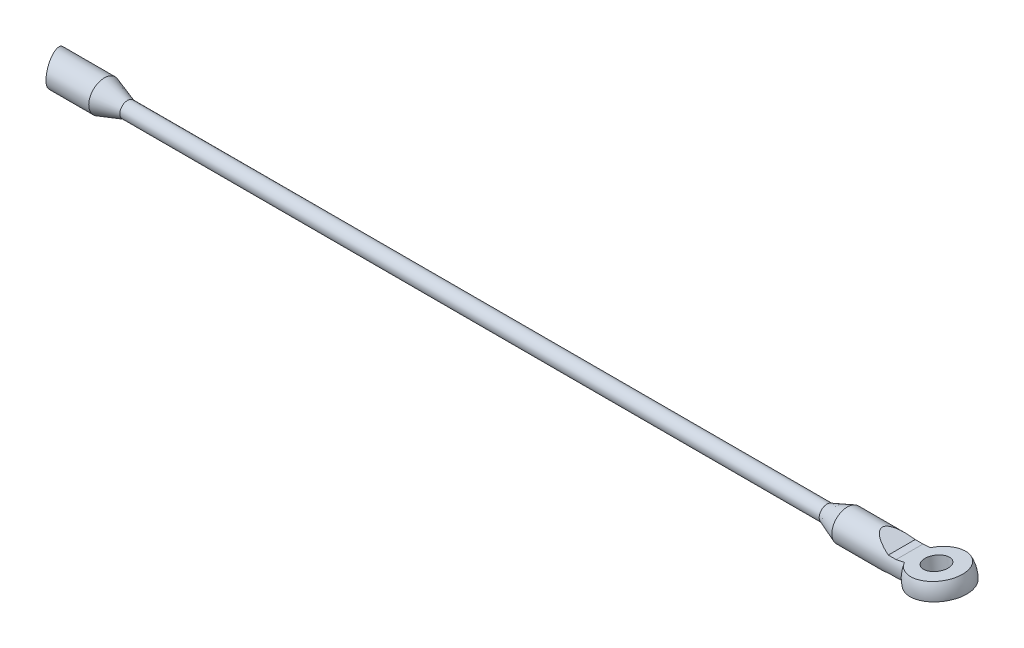
ISO-10303-21;
HEADER;
FILE_DESCRIPTION(('STEP AP214'),'2;1');
FILE_NAME('part.step','',(''),(''),'','','');
FILE_SCHEMA(('AUTOMOTIVE_DESIGN { 1 0 10303 214 1 1 1 1 }'));
ENDSEC;
DATA;
#1=APPLICATION_CONTEXT('core data for automotive mechanical design processes');
#2=APPLICATION_PROTOCOL_DEFINITION('international standard','automotive_design',2000,#1);
#3=PRODUCT_CONTEXT('',#1,'mechanical');
#4=PRODUCT('Part','Part','',(#3));
#5=PRODUCT_RELATED_PRODUCT_CATEGORY('part','',(#4));
#6=PRODUCT_DEFINITION_FORMATION('','',#4);
#7=PRODUCT_DEFINITION_CONTEXT('part definition',#1,'design');
#8=PRODUCT_DEFINITION('design','',#6,#7);
#9=PRODUCT_DEFINITION_SHAPE('','',#8);
#10=(LENGTH_UNIT() NAMED_UNIT(*) SI_UNIT(.MILLI.,.METRE.));
#11=(NAMED_UNIT(*) PLANE_ANGLE_UNIT() SI_UNIT($,.RADIAN.));
#12=(NAMED_UNIT(*) SI_UNIT($,.STERADIAN.) SOLID_ANGLE_UNIT());
#13=UNCERTAINTY_MEASURE_WITH_UNIT(LENGTH_MEASURE(1.E-05),#10,'distance_accuracy_value','');
#14=(GEOMETRIC_REPRESENTATION_CONTEXT(3) GLOBAL_UNCERTAINTY_ASSIGNED_CONTEXT((#13)) GLOBAL_UNIT_ASSIGNED_CONTEXT((#10,
#11,#12)) REPRESENTATION_CONTEXT('',''));
#15=CARTESIAN_POINT('',(0.,0.,0.));
#16=DIRECTION('',(0.,0.,1.));
#17=DIRECTION('',(1.,0.,0.));
#18=AXIS2_PLACEMENT_3D('',#15,#16,#17);
#19=CARTESIAN_POINT('',(0.,0.,0.));
#20=DIRECTION('',(-1.,0.,0.));
#21=DIRECTION('',(0.,0.,1.));
#22=AXIS2_PLACEMENT_3D('',#19,#20,#21);
#23=CYLINDRICAL_SURFACE('',#22,1.);
#24=CARTESIAN_POINT('',(52.3138593383655,0.,0.));
#25=DIRECTION('',(-1.,0.,0.));
#26=DIRECTION('',(0.,0.,1.));
#27=AXIS2_PLACEMENT_3D('',#24,#25,#26);
#28=CIRCLE('',#27,1.);
#29=CARTESIAN_POINT('',(52.3138593383655,0.,1.));
#30=VERTEX_POINT('',#29);
#31=EDGE_CURVE('E153',#30,#30,#28,.T.);
#32=ORIENTED_EDGE('',*,*,#31,.F.);
#33=EDGE_LOOP('',(#32));
#34=FACE_BOUND('',#33,.T.);
#35=CARTESIAN_POINT('',(52.5159822820029,0.,0.));
#36=DIRECTION('',(-0.130526192220052,0.99144486137381,0.));
#37=DIRECTION('',(-0.99144486137381,-0.130526192220052,0.));
#38=AXIS2_PLACEMENT_3D('',#35,#36,#37);
#39=ELLIPSE('',#38,7.66129757554036,1.);
#40=CARTESIAN_POINT('',(56.3138593383655,0.5,0.86602540378444));
#41=VERTEX_POINT('',#40);
#42=CARTESIAN_POINT('',(56.8138593383655,0.565826248793697,0.824524503078021));
#43=VERTEX_POINT('',#42);
#44=EDGE_CURVE('E58',#41,#43,#39,.T.);
#45=ORIENTED_EDGE('',*,*,#44,.F.);
#46=DIRECTION('',(-1.,0.,0.));
#47=VECTOR('',#46,1.);
#48=CARTESIAN_POINT('',(0.,0.5,0.86602540378444));
#49=LINE('',#48,#47);
#50=CARTESIAN_POINT('',(55.8138593383655,0.5,0.866025403784429));
#51=VERTEX_POINT('',#50);
#52=EDGE_CURVE('E51',#51,#41,#49,.F.);
#53=ORIENTED_EDGE('',*,*,#52,.F.);
#54=CARTESIAN_POINT('',(57.0638593383655,0.,0.));
#55=DIRECTION('',(0.371390676354104,0.928476690885259,0.));
#56=DIRECTION('',(-0.928476690885259,0.371390676354104,0.));
#57=AXIS2_PLACEMENT_3D('',#54,#55,#56);
#58=ELLIPSE('',#57,2.69258240356725,1.);
#59=CARTESIAN_POINT('',(55.8138593383655,0.5,-0.86602540378444));
#60=VERTEX_POINT('',#59);
#61=EDGE_CURVE('E65',#60,#51,#58,.T.);
#62=ORIENTED_EDGE('',*,*,#61,.F.);
#63=DIRECTION('',(-1.,0.,0.));
#64=VECTOR('',#63,1.);
#65=CARTESIAN_POINT('',(0.,0.5,-0.86602540378444));
#66=LINE('',#65,#64);
#67=CARTESIAN_POINT('',(56.3138593383655,0.5,-0.866025403784429));
#68=VERTEX_POINT('',#67);
#69=EDGE_CURVE('E131',#68,#60,#66,.T.);
#70=ORIENTED_EDGE('',*,*,#69,.F.);
#71=CARTESIAN_POINT('',(56.8138593383655,0.565826248793697,-0.824524503078021));
#72=VERTEX_POINT('',#71);
#73=EDGE_CURVE('E144',#72,#68,#39,.T.);
#74=ORIENTED_EDGE('',*,*,#73,.F.);
#75=CARTESIAN_POINT('',(56.8138593383655,0.,0.));
#76=DIRECTION('',(-1.,0.,0.));
#77=DIRECTION('',(0.,0.,1.));
#78=AXIS2_PLACEMENT_3D('',#75,#76,#77);
#79=CIRCLE('',#78,1.);
#80=CARTESIAN_POINT('',(56.8138593383655,-0.434173751206303,-0.900829147931753));
#81=VERTEX_POINT('',#80);
#82=EDGE_CURVE('E103',#72,#81,#79,.T.);
#83=ORIENTED_EDGE('',*,*,#82,.T.);
#84=CARTESIAN_POINT('',(60.1117363947281,0.,0.));
#85=DIRECTION('',(0.130526192220052,-0.99144486137381,0.));
#86=DIRECTION('',(-0.99144486137381,-0.130526192220052,0.));
#87=AXIS2_PLACEMENT_3D('',#84,#85,#86);
#88=ELLIPSE('',#87,7.66129757554037,1.);
#89=CARTESIAN_POINT('',(56.3138593383655,-0.5,-0.866025403784439));
#90=VERTEX_POINT('',#89);
#91=EDGE_CURVE('E112',#90,#81,#88,.T.);
#92=ORIENTED_EDGE('',*,*,#91,.F.);
#93=DIRECTION('',(-1.,0.,0.));
#94=VECTOR('',#93,1.);
#95=CARTESIAN_POINT('',(0.,-0.5,-0.866025403784439));
#96=LINE('',#95,#94);
#97=CARTESIAN_POINT('',(55.8138593383655,-0.5,-0.866025403784443));
#98=VERTEX_POINT('',#97);
#99=EDGE_CURVE('E127',#98,#90,#96,.F.);
#100=ORIENTED_EDGE('',*,*,#99,.F.);
#101=CARTESIAN_POINT('',(57.0638593383655,0.,0.));
#102=DIRECTION('',(0.371390676354104,-0.928476690885259,0.));
#103=DIRECTION('',(-0.928476690885259,-0.371390676354104,0.));
#104=AXIS2_PLACEMENT_3D('',#101,#102,#103);
#105=ELLIPSE('',#104,2.69258240356725,1.);
#106=CARTESIAN_POINT('',(55.8138593383655,-0.5,0.866025403784443));
#107=VERTEX_POINT('',#106);
#108=EDGE_CURVE('E119',#107,#98,#105,.T.);
#109=ORIENTED_EDGE('',*,*,#108,.F.);
#110=DIRECTION('',(-1.,0.,0.));
#111=VECTOR('',#110,1.);
#112=CARTESIAN_POINT('',(0.,-0.5,0.866025403784439));
#113=LINE('',#112,#111);
#114=CARTESIAN_POINT('',(56.3138593383655,-0.5,0.866025403784439));
#115=VERTEX_POINT('',#114);
#116=EDGE_CURVE('E108',#115,#107,#113,.T.);
#117=ORIENTED_EDGE('',*,*,#116,.F.);
#118=CARTESIAN_POINT('',(56.8138593383655,-0.434173751206303,0.900829147931753));
#119=VERTEX_POINT('',#118);
#120=EDGE_CURVE('E106',#119,#115,#88,.T.);
#121=ORIENTED_EDGE('',*,*,#120,.F.);
#122=EDGE_CURVE('E95',#119,#43,#79,.T.);
#123=ORIENTED_EDGE('',*,*,#122,.T.);
#124=EDGE_LOOP('',(#45,#53,#62,#70,#74,#83,#92,#100,#109,#117,#121,#123));
#125=FACE_BOUND('',#124,.T.);
#126=ADVANCED_FACE('F43',(#34,#125),#23,.T.);
#127=CARTESIAN_POINT('',(58.25,0.,0.));
#128=DIRECTION('',(-1.,0.,0.));
#129=DIRECTION('',(0.,1.,0.));
#130=AXIS2_PLACEMENT_3D('',#127,#128,#129);
#131=SPHERICAL_SURFACE('',#130,1.75);
#132=CARTESIAN_POINT('',(58.1523090421077,0.74203649518647,0.));
#133=DIRECTION('',(-0.130526192220052,0.99144486137381,0.));
#134=DIRECTION('',(-0.99144486137381,-0.130526192220052,0.));
#135=AXIS2_PLACEMENT_3D('',#132,#133,#134);
#136=CIRCLE('',#135,1.58187809788159);
#137=EDGE_CURVE('E102',#43,#72,#136,.T.);
#138=ORIENTED_EDGE('',*,*,#137,.F.);
#139=ORIENTED_EDGE('',*,*,#122,.F.);
#140=CARTESIAN_POINT('',(58.281718564659,-0.240926417958064,0.));
#141=DIRECTION('',(0.130526192220052,-0.99144486137381,0.));
#142=DIRECTION('',(0.99144486137381,0.130526192220052,0.));
#143=AXIS2_PLACEMENT_3D('',#140,#141,#142);
#144=CIRCLE('',#143,1.73304598721034);
#145=EDGE_CURVE('E99',#81,#119,#144,.T.);
#146=ORIENTED_EDGE('',*,*,#145,.F.);
#147=ORIENTED_EDGE('',*,*,#82,.F.);
#148=EDGE_LOOP('',(#138,#139,#146,#147));
#149=FACE_BOUND('',#148,.T.);
#150=ADVANCED_FACE('F97',(#149),#131,.T.);
#151=CARTESIAN_POINT('',(0.,0.,0.));
#152=DIRECTION('',(-1.,0.,0.));
#153=DIRECTION('',(0.,0.,1.));
#154=AXIS2_PLACEMENT_3D('',#151,#152,#153);
#155=CYLINDRICAL_SURFACE('',#154,1.);
#156=CARTESIAN_POINT('',(1.375,0.,0.));
#157=DIRECTION('',(0.936329177569045,0.,-0.351123441588392));
#158=DIRECTION('',(-0.351123441588392,0.,-0.936329177569044));
#159=AXIS2_PLACEMENT_3D('',#156,#157,#158);
#160=ELLIPSE('',#159,1.06800046816469,1.);
#161=CARTESIAN_POINT('',(1.,0.,-1.));
#162=VERTEX_POINT('',#161);
#163=EDGE_CURVE('E11',#162,#162,#160,.T.);
#164=ORIENTED_EDGE('',*,*,#163,.T.);
#165=EDGE_LOOP('',(#164));
#166=FACE_BOUND('',#165,.T.);
#167=CARTESIAN_POINT('',(4.5,0.,0.));
#168=DIRECTION('',(-1.,0.,0.));
#169=DIRECTION('',(0.,0.,1.));
#170=AXIS2_PLACEMENT_3D('',#167,#168,#169);
#171=CIRCLE('',#170,1.);
#172=CARTESIAN_POINT('',(4.5,0.,1.));
#173=VERTEX_POINT('',#172);
#174=EDGE_CURVE('E117',#173,#173,#171,.T.);
#175=ORIENTED_EDGE('',*,*,#174,.T.);
#176=EDGE_LOOP('',(#175));
#177=FACE_BOUND('',#176,.T.);
#178=ADVANCED_FACE('F45',(#166,#177),#155,.T.);
#179=CARTESIAN_POINT('',(6.,0.,0.));
#180=DIRECTION('',(-1.,0.,0.));
#181=DIRECTION('',(0.,0.,1.));
#182=AXIS2_PLACEMENT_3D('',#179,#180,#181);
#183=CONICAL_SURFACE('',#182,0.5,0.321750554396642);
#184=ORIENTED_EDGE('',*,*,#174,.F.);
#185=EDGE_LOOP('',(#184));
#186=FACE_BOUND('',#185,.T.);
#187=CARTESIAN_POINT('',(6.,0.,0.));
#188=DIRECTION('',(-1.,0.,0.));
#189=DIRECTION('',(0.,0.,1.));
#190=AXIS2_PLACEMENT_3D('',#187,#188,#189);
#191=CIRCLE('',#190,0.5);
#192=CARTESIAN_POINT('',(6.,0.,0.5));
#193=VERTEX_POINT('',#192);
#194=EDGE_CURVE('E122',#193,#193,#191,.T.);
#195=ORIENTED_EDGE('',*,*,#194,.T.);
#196=EDGE_LOOP('',(#195));
#197=FACE_BOUND('',#196,.T.);
#198=ADVANCED_FACE('F161',(#186,#197),#183,.T.);
#199=CARTESIAN_POINT('',(0.,0.,0.));
#200=DIRECTION('',(-1.,0.,0.));
#201=DIRECTION('',(0.,0.,1.));
#202=AXIS2_PLACEMENT_3D('',#199,#200,#201);
#203=CYLINDRICAL_SURFACE('',#202,0.5);
#204=ORIENTED_EDGE('',*,*,#194,.F.);
#205=EDGE_LOOP('',(#204));
#206=FACE_BOUND('',#205,.T.);
#207=CARTESIAN_POINT('',(51.,0.,0.));
#208=DIRECTION('',(-1.,0.,0.));
#209=DIRECTION('',(0.,0.,1.));
#210=AXIS2_PLACEMENT_3D('',#207,#208,#209);
#211=CIRCLE('',#210,0.5);
#212=CARTESIAN_POINT('',(51.,0.,0.5));
#213=VERTEX_POINT('',#212);
#214=EDGE_CURVE('E156',#213,#213,#211,.T.);
#215=ORIENTED_EDGE('',*,*,#214,.T.);
#216=EDGE_LOOP('',(#215));
#217=FACE_BOUND('',#216,.T.);
#218=ADVANCED_FACE('F163',(#206,#217),#203,.T.);
#219=CARTESIAN_POINT('',(52.3138593383655,0.,0.));
#220=DIRECTION('',(1.,0.,0.));
#221=DIRECTION('',(0.,0.,-1.));
#222=AXIS2_PLACEMENT_3D('',#219,#220,#221);
#223=CONICAL_SURFACE('',#222,1.,0.363634722689148);
#224=ORIENTED_EDGE('',*,*,#214,.F.);
#225=EDGE_LOOP('',(#224));
#226=FACE_BOUND('',#225,.T.);
#227=ORIENTED_EDGE('',*,*,#31,.T.);
#228=EDGE_LOOP('',(#227));
#229=FACE_BOUND('',#228,.T.);
#230=ADVANCED_FACE('F166',(#226,#229),#223,.T.);
#231=CARTESIAN_POINT('',(55.8138593383655,-0.5,76.5047755959713));
#232=DIRECTION('',(0.371390676354104,-0.928476690885259,0.));
#233=DIRECTION('',(0.92847669088526,0.371390676354104,0.));
#234=AXIS2_PLACEMENT_3D('',#231,#232,#233);
#235=PLANE('',#234);
#236=ORIENTED_EDGE('',*,*,#108,.T.);
#237=DIRECTION('',(0.,0.,-1.));
#238=VECTOR('',#237,1.);
#239=CARTESIAN_POINT('',(55.8138593383655,-0.5,76.5047755959713));
#240=LINE('',#239,#238);
#241=EDGE_CURVE('E148',#107,#98,#240,.T.);
#242=ORIENTED_EDGE('',*,*,#241,.F.);
#243=EDGE_LOOP('',(#236,#242));
#244=FACE_BOUND('',#243,.T.);
#245=ADVANCED_FACE('F172',(#244),#235,.T.);
#246=CARTESIAN_POINT('',(60.3138593383655,0.0266099903495847,76.5047755959713));
#247=DIRECTION('',(0.130526192220052,-0.99144486137381,0.));
#248=DIRECTION('',(0.99144486137381,0.130526192220052,0.));
#249=AXIS2_PLACEMENT_3D('',#246,#247,#248);
#250=PLANE('',#249);
#251=CARTESIAN_POINT('',(58.1782973683209,-0.254542076759442,0.));
#252=DIRECTION('',(0.130526192220052,-0.99144486137381,0.));
#253=DIRECTION('',(0.99144486137381,0.130526192220052,0.));
#254=AXIS2_PLACEMENT_3D('',#251,#252,#253);
#255=CIRCLE('',#254,0.750000000000002);
#256=CARTESIAN_POINT('',(58.9218810143513,-0.156647432594403,0.));
#257=VERTEX_POINT('',#256);
#258=EDGE_CURVE('E301',#257,#257,#255,.T.);
#259=ORIENTED_EDGE('',*,*,#258,.F.);
#260=EDGE_LOOP('',(#259));
#261=FACE_BOUND('',#260,.T.);
#262=DIRECTION('',(0.,0.,-1.));
#263=VECTOR('',#262,1.);
#264=CARTESIAN_POINT('',(56.3138593383655,-0.5,76.5047755959713));
#265=LINE('',#264,#263);
#266=EDGE_CURVE('E145',#115,#90,#265,.T.);
#267=ORIENTED_EDGE('',*,*,#266,.T.);
#268=ORIENTED_EDGE('',*,*,#91,.T.);
#269=ORIENTED_EDGE('',*,*,#145,.T.);
#270=ORIENTED_EDGE('',*,*,#120,.T.);
#271=EDGE_LOOP('',(#267,#268,#269,#270));
#272=FACE_BOUND('',#271,.T.);
#273=ADVANCED_FACE('F116',(#261,#272),#250,.T.);
#274=CARTESIAN_POINT('',(56.3138593383655,-0.5,76.5047755959713));
#275=DIRECTION('',(0.,-1.,0.));
#276=DIRECTION('',(0.,0.,-1.));
#277=AXIS2_PLACEMENT_3D('',#274,#275,#276);
#278=PLANE('',#277);
#279=ORIENTED_EDGE('',*,*,#266,.F.);
#280=ORIENTED_EDGE('',*,*,#116,.T.);
#281=ORIENTED_EDGE('',*,*,#241,.T.);
#282=ORIENTED_EDGE('',*,*,#99,.T.);
#283=EDGE_LOOP('',(#279,#280,#281,#282));
#284=FACE_BOUND('',#283,.T.);
#285=ADVANCED_FACE('F208',(#284),#278,.T.);
#286=CARTESIAN_POINT('',(54.5638593383655,1.,76.5047755959713));
#287=DIRECTION('',(0.371390676354104,0.928476690885259,0.));
#288=DIRECTION('',(-0.928476690885259,0.371390676354104,0.));
#289=AXIS2_PLACEMENT_3D('',#286,#287,#288);
#290=PLANE('',#289);
#291=ORIENTED_EDGE('',*,*,#61,.T.);
#292=DIRECTION('',(0.,0.,-1.));
#293=VECTOR('',#292,1.);
#294=CARTESIAN_POINT('',(55.8138593383655,0.5,76.5047755959713));
#295=LINE('',#294,#293);
#296=EDGE_CURVE('E113',#51,#60,#295,.T.);
#297=ORIENTED_EDGE('',*,*,#296,.T.);
#298=EDGE_LOOP('',(#291,#297));
#299=FACE_BOUND('',#298,.T.);
#300=ADVANCED_FACE('F211',(#299),#290,.T.);
#301=CARTESIAN_POINT('',(55.8138593383655,0.5,76.5047755959713));
#302=DIRECTION('',(0.,1.,0.));
#303=DIRECTION('',(0.,0.,1.));
#304=AXIS2_PLACEMENT_3D('',#301,#302,#303);
#305=PLANE('',#304);
#306=DIRECTION('',(0.,0.,-1.));
#307=VECTOR('',#306,1.);
#308=CARTESIAN_POINT('',(56.3138593383655,0.5,76.5047755959713));
#309=LINE('',#308,#307);
#310=EDGE_CURVE('E139',#41,#68,#309,.T.);
#311=ORIENTED_EDGE('',*,*,#310,.T.);
#312=ORIENTED_EDGE('',*,*,#69,.T.);
#313=ORIENTED_EDGE('',*,*,#296,.F.);
#314=ORIENTED_EDGE('',*,*,#52,.T.);
#315=EDGE_LOOP('',(#311,#312,#313,#314));
#316=FACE_BOUND('',#315,.T.);
#317=ADVANCED_FACE('F138',(#316),#305,.T.);
#318=CARTESIAN_POINT('',(56.3138593383655,0.5,76.5047755959713));
#319=DIRECTION('',(-0.130526192220052,0.99144486137381,0.));
#320=DIRECTION('',(-0.99144486137381,-0.130526192220052,0.));
#321=AXIS2_PLACEMENT_3D('',#318,#319,#320);
#322=PLANE('',#321);
#323=CARTESIAN_POINT('',(58.0488878457697,0.728420836385091,0.));
#324=DIRECTION('',(-0.130526192220052,0.99144486137381,0.));
#325=DIRECTION('',(-0.99144486137381,-0.130526192220052,0.));
#326=AXIS2_PLACEMENT_3D('',#323,#324,#325);
#327=CIRCLE('',#326,0.750000000000002);
#328=CARTESIAN_POINT('',(57.3053041997393,0.630526192220052,0.));
#329=VERTEX_POINT('',#328);
#330=EDGE_CURVE('E299',#329,#329,#327,.T.);
#331=ORIENTED_EDGE('',*,*,#330,.F.);
#332=EDGE_LOOP('',(#331));
#333=FACE_BOUND('',#332,.T.);
#334=ORIENTED_EDGE('',*,*,#310,.F.);
#335=ORIENTED_EDGE('',*,*,#44,.T.);
#336=ORIENTED_EDGE('',*,*,#137,.T.);
#337=ORIENTED_EDGE('',*,*,#73,.T.);
#338=EDGE_LOOP('',(#334,#335,#336,#337));
#339=FACE_BOUND('',#338,.T.);
#340=ADVANCED_FACE('F142',(#333,#339),#322,.T.);
#341=CARTESIAN_POINT('',(58.3058032282103,-1.22304523641062,0.));
#342=DIRECTION('',(-0.130526192220052,0.99144486137381,0.));
#343=DIRECTION('',(-0.99144486137381,-0.130526192220052,0.));
#344=AXIS2_PLACEMENT_3D('',#341,#342,#343);
#345=CYLINDRICAL_SURFACE('',#344,0.750000000000002);
#346=ORIENTED_EDGE('',*,*,#258,.T.);
#347=EDGE_LOOP('',(#346));
#348=FACE_BOUND('',#347,.T.);
#349=ORIENTED_EDGE('',*,*,#330,.T.);
#350=EDGE_LOOP('',(#349));
#351=FACE_BOUND('',#350,.T.);
#352=ADVANCED_FACE('F198',(#348,#351),#345,.F.);
#353=CARTESIAN_POINT('',(1.,-5.5,-1.));
#354=DIRECTION('',(0.936329177569045,0.,-0.351123441588392));
#355=DIRECTION('',(-0.351123441588392,0.,-0.936329177569044));
#356=AXIS2_PLACEMENT_3D('',#353,#354,#355);
#357=PLANE('',#356);
#358=ORIENTED_EDGE('',*,*,#163,.F.);
#359=EDGE_LOOP('',(#358));
#360=FACE_BOUND('',#359,.T.);
#361=ADVANCED_FACE('F197',(#360),#357,.F.);
#362=CLOSED_SHELL('',(#126,#150,#178,#198,#218,#230,#245,#273,#285,#300,#317,#340,#352,#361));
#363=MANIFOLD_SOLID_BREP('B2',#362);
#364=ADVANCED_BREP_SHAPE_REPRESENTATION('',(#18,#363),#14);
#365=SHAPE_DEFINITION_REPRESENTATION(#9,#364);
ENDSEC;
END-ISO-10303-21;
